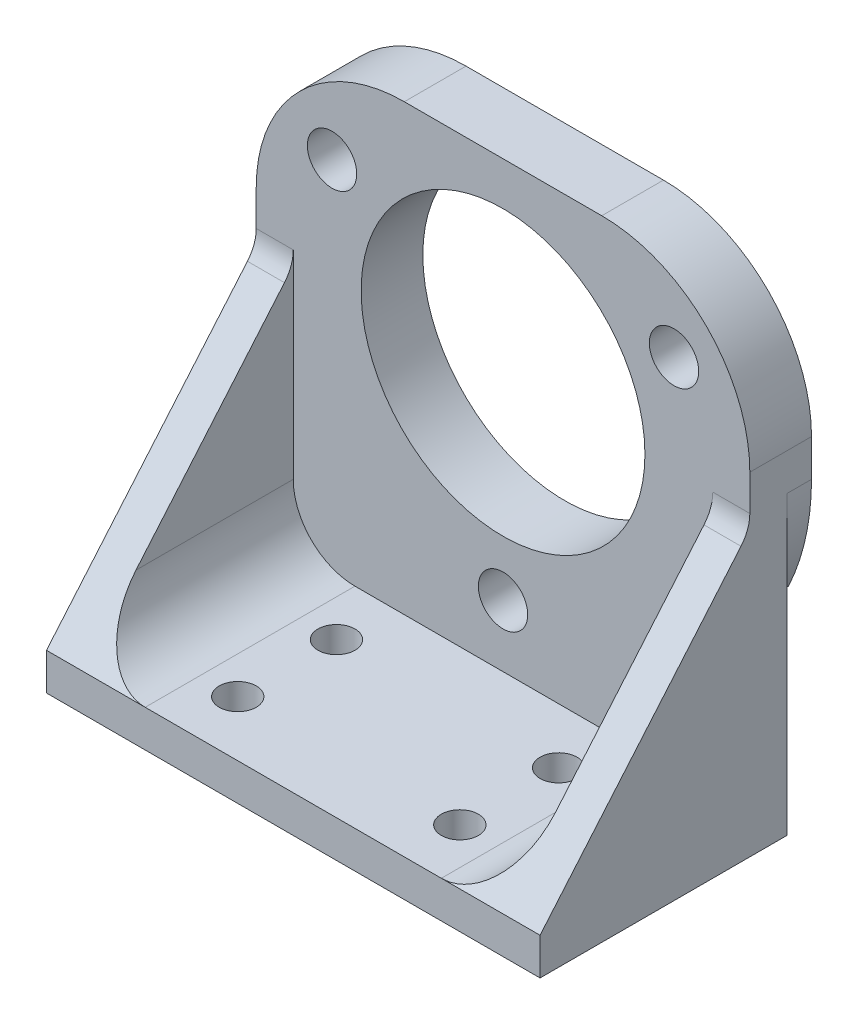
ISO-10303-21;
HEADER;
FILE_DESCRIPTION(('STEP AP214'),'2;1');
FILE_NAME('part.step','',(''),(''),'','','');
FILE_SCHEMA(('AUTOMOTIVE_DESIGN { 1 0 10303 214 1 1 1 1 }'));
ENDSEC;
DATA;
#1=APPLICATION_CONTEXT('core data for automotive mechanical design processes');
#2=APPLICATION_PROTOCOL_DEFINITION('international standard','automotive_design',2000,#1);
#3=PRODUCT_CONTEXT('',#1,'mechanical');
#4=PRODUCT('Part','Part','',(#3));
#5=PRODUCT_RELATED_PRODUCT_CATEGORY('part','',(#4));
#6=PRODUCT_DEFINITION_FORMATION('','',#4);
#7=PRODUCT_DEFINITION_CONTEXT('part definition',#1,'design');
#8=PRODUCT_DEFINITION('design','',#6,#7);
#9=PRODUCT_DEFINITION_SHAPE('','',#8);
#10=(LENGTH_UNIT() NAMED_UNIT(*) SI_UNIT(.MILLI.,.METRE.));
#11=(NAMED_UNIT(*) PLANE_ANGLE_UNIT() SI_UNIT($,.RADIAN.));
#12=(NAMED_UNIT(*) SI_UNIT($,.STERADIAN.) SOLID_ANGLE_UNIT());
#13=UNCERTAINTY_MEASURE_WITH_UNIT(LENGTH_MEASURE(1.E-05),#10,'distance_accuracy_value','');
#14=(GEOMETRIC_REPRESENTATION_CONTEXT(3) GLOBAL_UNCERTAINTY_ASSIGNED_CONTEXT((#13)) GLOBAL_UNIT_ASSIGNED_CONTEXT((#10,
#11,#12)) REPRESENTATION_CONTEXT('',''));
#15=CARTESIAN_POINT('',(0.,0.,0.));
#16=DIRECTION('',(0.,0.,1.));
#17=DIRECTION('',(1.,0.,0.));
#18=AXIS2_PLACEMENT_3D('',#15,#16,#17);
#19=CARTESIAN_POINT('',(0.,3.,0.));
#20=DIRECTION('',(0.,-1.,0.));
#21=DIRECTION('',(0.,0.,-1.));
#22=AXIS2_PLACEMENT_3D('',#19,#20,#21);
#23=PLANE('',#22);
#24=CARTESIAN_POINT('',(9.,3.,5.5));
#25=DIRECTION('',(0.,1.,0.));
#26=DIRECTION('',(0.,0.,1.));
#27=AXIS2_PLACEMENT_3D('',#24,#25,#26);
#28=CIRCLE('',#27,1.5);
#29=CARTESIAN_POINT('',(9.,3.,7.));
#30=VERTEX_POINT('',#29);
#31=EDGE_CURVE('E791',#30,#30,#28,.T.);
#32=ORIENTED_EDGE('',*,*,#31,.F.);
#33=EDGE_LOOP('',(#32));
#34=FACE_BOUND('',#33,.T.);
#35=CARTESIAN_POINT('',(-9.,3.,-2.5));
#36=DIRECTION('',(0.,1.,0.));
#37=DIRECTION('',(0.,0.,1.));
#38=AXIS2_PLACEMENT_3D('',#35,#36,#37);
#39=CIRCLE('',#38,1.5);
#40=CARTESIAN_POINT('',(-9.,3.,-1.));
#41=VERTEX_POINT('',#40);
#42=EDGE_CURVE('E784',#41,#41,#39,.T.);
#43=ORIENTED_EDGE('',*,*,#42,.F.);
#44=EDGE_LOOP('',(#43));
#45=FACE_BOUND('',#44,.T.);
#46=CARTESIAN_POINT('',(-9.,3.,5.5));
#47=DIRECTION('',(0.,1.,0.));
#48=DIRECTION('',(0.,0.,-1.));
#49=AXIS2_PLACEMENT_3D('',#46,#47,#48);
#50=CIRCLE('',#49,1.5);
#51=CARTESIAN_POINT('',(-9.,3.,4.));
#52=VERTEX_POINT('',#51);
#53=EDGE_CURVE('E796',#52,#52,#50,.T.);
#54=ORIENTED_EDGE('',*,*,#53,.F.);
#55=EDGE_LOOP('',(#54));
#56=FACE_BOUND('',#55,.T.);
#57=CARTESIAN_POINT('',(9.,3.,-2.5));
#58=DIRECTION('',(0.,1.,0.));
#59=DIRECTION('',(0.,0.,-1.));
#60=AXIS2_PLACEMENT_3D('',#57,#58,#59);
#61=CIRCLE('',#60,1.5);
#62=CARTESIAN_POINT('',(9.,3.,-4.));
#63=VERTEX_POINT('',#62);
#64=EDGE_CURVE('E778',#63,#63,#61,.T.);
#65=ORIENTED_EDGE('',*,*,#64,.F.);
#66=EDGE_LOOP('',(#65));
#67=FACE_BOUND('',#66,.T.);
#68=DIRECTION('',(1.,0.,0.));
#69=VECTOR('',#68,1.);
#70=CARTESIAN_POINT('',(-20.,3.,10.));
#71=LINE('',#70,#69);
#72=CARTESIAN_POINT('',(-12.,3.,10.));
#73=VERTEX_POINT('',#72);
#74=CARTESIAN_POINT('',(12.,3.,10.));
#75=VERTEX_POINT('',#74);
#76=EDGE_CURVE('E211',#73,#75,#71,.T.);
#77=ORIENTED_EDGE('',*,*,#76,.T.);
#78=DIRECTION('',(0.,0.,1.));
#79=VECTOR('',#78,1.);
#80=CARTESIAN_POINT('',(12.,3.,-7.));
#81=LINE('',#80,#79);
#82=CARTESIAN_POINT('',(12.,3.,-7.));
#83=VERTEX_POINT('',#82);
#84=EDGE_CURVE('E253',#75,#83,#81,.F.);
#85=ORIENTED_EDGE('',*,*,#84,.T.);
#86=DIRECTION('',(1.,0.,0.));
#87=VECTOR('',#86,1.);
#88=CARTESIAN_POINT('',(-20.,3.,-7.));
#89=LINE('',#88,#87);
#90=CARTESIAN_POINT('',(-12.,3.,-7.));
#91=VERTEX_POINT('',#90);
#92=EDGE_CURVE('E371',#91,#83,#89,.T.);
#93=ORIENTED_EDGE('',*,*,#92,.F.);
#94=DIRECTION('',(0.,0.,-1.));
#95=VECTOR('',#94,1.);
#96=CARTESIAN_POINT('',(-12.,3.,10.));
#97=LINE('',#96,#95);
#98=EDGE_CURVE('E250',#91,#73,#97,.F.);
#99=ORIENTED_EDGE('',*,*,#98,.T.);
#100=EDGE_LOOP('',(#77,#85,#93,#99));
#101=FACE_BOUND('',#100,.T.);
#102=ADVANCED_FACE('F39',(#34,#45,#56,#67,#101),#23,.F.);
#103=CARTESIAN_POINT('',(-20.,39.,-7.));
#104=DIRECTION('',(0.,0.,-1.));
#105=DIRECTION('',(-1.,0.,0.));
#106=AXIS2_PLACEMENT_3D('',#103,#104,#105);
#107=PLANE('',#106);
#108=CARTESIAN_POINT('',(0.,24.,-7.));
#109=DIRECTION('',(0.,0.,1.));
#110=DIRECTION('',(1.,0.,0.));
#111=AXIS2_PLACEMENT_3D('',#108,#109,#110);
#112=CIRCLE('',#111,11.5);
#113=CARTESIAN_POINT('',(11.5,24.,-7.));
#114=VERTEX_POINT('',#113);
#115=EDGE_CURVE('E363',#114,#114,#112,.T.);
#116=ORIENTED_EDGE('',*,*,#115,.F.);
#117=EDGE_LOOP('',(#116));
#118=FACE_BOUND('',#117,.T.);
#119=CARTESIAN_POINT('',(0.,8.,-7.));
#120=DIRECTION('',(0.,0.,1.));
#121=DIRECTION('',(1.,0.,0.));
#122=AXIS2_PLACEMENT_3D('',#119,#120,#121);
#123=CIRCLE('',#122,2.);
#124=CARTESIAN_POINT('',(1.99999999999996,8.,-7.));
#125=VERTEX_POINT('',#124);
#126=EDGE_CURVE('E364',#125,#125,#123,.T.);
#127=ORIENTED_EDGE('',*,*,#126,.F.);
#128=EDGE_LOOP('',(#127));
#129=FACE_BOUND('',#128,.T.);
#130=DIRECTION('',(0.,-1.,0.));
#131=VECTOR('',#130,1.);
#132=CARTESIAN_POINT('',(17.,23.,-7.));
#133=LINE('',#132,#131);
#134=CARTESIAN_POINT('',(17.,24.1027310876729,-7.));
#135=VERTEX_POINT('',#134);
#136=CARTESIAN_POINT('',(17.,8.,-7.));
#137=VERTEX_POINT('',#136);
#138=EDGE_CURVE('E300',#135,#137,#133,.T.);
#139=ORIENTED_EDGE('',*,*,#138,.F.);
#140=DIRECTION('',(-1.,0.,0.));
#141=VECTOR('',#140,1.);
#142=CARTESIAN_POINT('',(20.,24.1027310876729,-7.));
#143=LINE('',#142,#141);
#144=CARTESIAN_POINT('',(20.,24.1027310876729,-7.));
#145=VERTEX_POINT('',#144);
#146=EDGE_CURVE('E271',#135,#145,#143,.F.);
#147=ORIENTED_EDGE('',*,*,#146,.T.);
#148=DIRECTION('',(0.,-1.,0.));
#149=VECTOR('',#148,1.);
#150=CARTESIAN_POINT('',(20.,39.,-7.));
#151=LINE('',#150,#149);
#152=CARTESIAN_POINT('',(20.,27.,-7.));
#153=VERTEX_POINT('',#152);
#154=EDGE_CURVE('E292',#153,#145,#151,.T.);
#155=ORIENTED_EDGE('',*,*,#154,.F.);
#156=CARTESIAN_POINT('',(8.,27.,-7.));
#157=DIRECTION('',(0.,0.,-1.));
#158=DIRECTION('',(-1.,0.,0.));
#159=AXIS2_PLACEMENT_3D('',#156,#157,#158);
#160=CIRCLE('',#159,12.);
#161=CARTESIAN_POINT('',(8.,39.,-7.));
#162=VERTEX_POINT('',#161);
#163=EDGE_CURVE('E227',#153,#162,#160,.F.);
#164=ORIENTED_EDGE('',*,*,#163,.T.);
#165=DIRECTION('',(1.,0.,0.));
#166=VECTOR('',#165,1.);
#167=CARTESIAN_POINT('',(-20.,39.,-7.));
#168=LINE('',#167,#166);
#169=CARTESIAN_POINT('',(-8.,39.,-7.));
#170=VERTEX_POINT('',#169);
#171=EDGE_CURVE('E372',#170,#162,#168,.T.);
#172=ORIENTED_EDGE('',*,*,#171,.F.);
#173=CARTESIAN_POINT('',(-8.,27.,-7.));
#174=DIRECTION('',(0.,0.,-1.));
#175=DIRECTION('',(-1.,0.,0.));
#176=AXIS2_PLACEMENT_3D('',#173,#174,#175);
#177=CIRCLE('',#176,12.);
#178=CARTESIAN_POINT('',(-20.,27.,-7.));
#179=VERTEX_POINT('',#178);
#180=EDGE_CURVE('E229',#170,#179,#177,.F.);
#181=ORIENTED_EDGE('',*,*,#180,.T.);
#182=DIRECTION('',(0.,-1.,0.));
#183=VECTOR('',#182,1.);
#184=CARTESIAN_POINT('',(-20.,39.,-7.));
#185=LINE('',#184,#183);
#186=CARTESIAN_POINT('',(-20.,24.1027310876729,-7.));
#187=VERTEX_POINT('',#186);
#188=EDGE_CURVE('E284',#179,#187,#185,.T.);
#189=ORIENTED_EDGE('',*,*,#188,.T.);
#190=DIRECTION('',(-1.,0.,0.));
#191=VECTOR('',#190,1.);
#192=CARTESIAN_POINT('',(-17.,24.1027310876729,-7.));
#193=LINE('',#192,#191);
#194=CARTESIAN_POINT('',(-17.,24.1027310876729,-7.));
#195=VERTEX_POINT('',#194);
#196=EDGE_CURVE('E268',#187,#195,#193,.F.);
#197=ORIENTED_EDGE('',*,*,#196,.T.);
#198=DIRECTION('',(0.,-1.,0.));
#199=VECTOR('',#198,1.);
#200=CARTESIAN_POINT('',(-17.,23.,-7.));
#201=LINE('',#200,#199);
#202=CARTESIAN_POINT('',(-17.,8.,-7.));
#203=VERTEX_POINT('',#202);
#204=EDGE_CURVE('E303',#195,#203,#201,.T.);
#205=ORIENTED_EDGE('',*,*,#204,.T.);
#206=CARTESIAN_POINT('',(-12.,8.,-7.));
#207=DIRECTION('',(0.,0.,-1.));
#208=DIRECTION('',(-1.,0.,0.));
#209=AXIS2_PLACEMENT_3D('',#206,#207,#208);
#210=CIRCLE('',#209,5.);
#211=EDGE_CURVE('E255',#203,#91,#210,.F.);
#212=ORIENTED_EDGE('',*,*,#211,.T.);
#213=ORIENTED_EDGE('',*,*,#92,.T.);
#214=CARTESIAN_POINT('',(12.,8.,-7.));
#215=DIRECTION('',(0.,0.,-1.));
#216=DIRECTION('',(-1.,0.,0.));
#217=AXIS2_PLACEMENT_3D('',#214,#215,#216);
#218=CIRCLE('',#217,5.);
#219=EDGE_CURVE('E257',#83,#137,#218,.F.);
#220=ORIENTED_EDGE('',*,*,#219,.T.);
#221=EDGE_LOOP('',(#139,#147,#155,#164,#172,#181,#189,#197,#205,#212,#213,#220));
#222=FACE_BOUND('',#221,.T.);
#223=CARTESIAN_POINT('',(13.856406460551,32.,-7.));
#224=DIRECTION('',(0.,0.,1.));
#225=DIRECTION('',(1.,0.,0.));
#226=AXIS2_PLACEMENT_3D('',#223,#224,#225);
#227=CIRCLE('',#226,2.00000000000001);
#228=CARTESIAN_POINT('',(15.856406460551,32.,-7.));
#229=VERTEX_POINT('',#228);
#230=EDGE_CURVE('E360',#229,#229,#227,.T.);
#231=ORIENTED_EDGE('',*,*,#230,.F.);
#232=EDGE_LOOP('',(#231));
#233=FACE_BOUND('',#232,.T.);
#234=CARTESIAN_POINT('',(-13.856406460551,32.,-7.));
#235=DIRECTION('',(0.,0.,1.));
#236=DIRECTION('',(1.,0.,0.));
#237=AXIS2_PLACEMENT_3D('',#234,#235,#236);
#238=CIRCLE('',#237,2.);
#239=CARTESIAN_POINT('',(-11.856406460551,32.,-7.));
#240=VERTEX_POINT('',#239);
#241=EDGE_CURVE('E359',#240,#240,#238,.T.);
#242=ORIENTED_EDGE('',*,*,#241,.F.);
#243=EDGE_LOOP('',(#242));
#244=FACE_BOUND('',#243,.T.);
#245=ADVANCED_FACE('F287',(#118,#129,#222,#233,#244),#107,.F.);
#246=CARTESIAN_POINT('',(0.,24.,-12.));
#247=DIRECTION('',(0.,0.,1.));
#248=DIRECTION('',(1.,0.,0.));
#249=AXIS2_PLACEMENT_3D('',#246,#247,#248);
#250=CYLINDRICAL_SURFACE('',#249,20.);
#251=CARTESIAN_POINT('',(0.,24.,-10.));
#252=DIRECTION('',(0.,0.,-1.));
#253=DIRECTION('',(-1.,0.,0.));
#254=AXIS2_PLACEMENT_3D('',#251,#252,#253);
#255=CIRCLE('',#254,20.);
#256=CARTESIAN_POINT('',(20.,24.,-10.));
#257=VERTEX_POINT('',#256);
#258=CARTESIAN_POINT('',(18.1379974784315,15.5730760373423,-10.));
#259=VERTEX_POINT('',#258);
#260=EDGE_CURVE('E350',#257,#259,#255,.T.);
#261=ORIENTED_EDGE('',*,*,#260,.T.);
#262=DIRECTION('',(0.,0.,-1.));
#263=VECTOR('',#262,1.);
#264=CARTESIAN_POINT('',(18.1379974784315,15.5730760373424,-11.));
#265=LINE('',#264,#263);
#266=CARTESIAN_POINT('',(18.1379974784315,15.5730760373423,-12.));
#267=VERTEX_POINT('',#266);
#268=EDGE_CURVE('E244',#259,#267,#265,.T.);
#269=ORIENTED_EDGE('',*,*,#268,.T.);
#270=CARTESIAN_POINT('',(0.,24.,-12.));
#271=DIRECTION('',(0.,0.,-1.));
#272=DIRECTION('',(-1.,0.,0.));
#273=AXIS2_PLACEMENT_3D('',#270,#271,#272);
#274=CIRCLE('',#273,20.);
#275=CARTESIAN_POINT('',(20.,24.,-12.));
#276=VERTEX_POINT('',#275);
#277=EDGE_CURVE('E330',#276,#267,#274,.T.);
#278=ORIENTED_EDGE('',*,*,#277,.F.);
#279=DIRECTION('',(0.,0.,1.));
#280=VECTOR('',#279,1.);
#281=CARTESIAN_POINT('',(20.,24.,-12.));
#282=LINE('',#281,#280);
#283=EDGE_CURVE('E349',#276,#257,#282,.T.);
#284=ORIENTED_EDGE('',*,*,#283,.T.);
#285=EDGE_LOOP('',(#261,#269,#278,#284));
#286=FACE_BOUND('',#285,.T.);
#287=ADVANCED_FACE('F394',(#286),#250,.T.);
#288=CARTESIAN_POINT('',(16.3669289666371,12.5054953912292,-12.));
#289=VERTEX_POINT('',#288);
#290=CARTESIAN_POINT('',(-16.3669289666371,12.5054953912292,-12.));
#291=VERTEX_POINT('',#290);
#292=EDGE_CURVE('E334',#289,#291,#274,.T.);
#293=ORIENTED_EDGE('',*,*,#292,.F.);
#294=DIRECTION('',(0.,0.,-1.));
#295=VECTOR('',#294,1.);
#296=CARTESIAN_POINT('',(16.3669289666371,12.5054953912291,-11.));
#297=LINE('',#296,#295);
#298=CARTESIAN_POINT('',(16.3669289666371,12.5054953912292,-10.));
#299=VERTEX_POINT('',#298);
#300=EDGE_CURVE('E241',#289,#299,#297,.F.);
#301=ORIENTED_EDGE('',*,*,#300,.T.);
#302=CARTESIAN_POINT('',(-16.3669289666371,12.5054953912292,-10.));
#303=VERTEX_POINT('',#302);
#304=EDGE_CURVE('E353',#299,#303,#255,.T.);
#305=ORIENTED_EDGE('',*,*,#304,.T.);
#306=DIRECTION('',(0.,0.,-1.));
#307=VECTOR('',#306,1.);
#308=CARTESIAN_POINT('',(-16.3669289666371,12.5054953912291,-11.));
#309=LINE('',#308,#307);
#310=EDGE_CURVE('E238',#303,#291,#309,.T.);
#311=ORIENTED_EDGE('',*,*,#310,.T.);
#312=EDGE_LOOP('',(#293,#301,#305,#311));
#313=FACE_BOUND('',#312,.T.);
#314=ADVANCED_FACE('F431',(#313),#250,.T.);
#315=CARTESIAN_POINT('',(20.,3.,10.));
#316=DIRECTION('',(-1.,0.,0.));
#317=DIRECTION('',(0.,0.,1.));
#318=AXIS2_PLACEMENT_3D('',#315,#316,#317);
#319=PLANE('',#318);
#320=ORIENTED_EDGE('',*,*,#154,.T.);
#321=CARTESIAN_POINT('',(20.,24.1027310876729,-4.));
#322=DIRECTION('',(-1.,0.,0.));
#323=DIRECTION('',(0.,0.,1.));
#324=AXIS2_PLACEMENT_3D('',#321,#322,#323);
#325=CIRCLE('',#324,3.);
#326=CARTESIAN_POINT('',(20.,22.1597858273863,-6.28581795327838));
#327=VERTEX_POINT('',#326);
#328=EDGE_CURVE('E188',#145,#327,#325,.T.);
#329=ORIENTED_EDGE('',*,*,#328,.T.);
#330=DIRECTION('',(0.,-0.761939317759459,0.64764842009554));
#331=VECTOR('',#330,1.);
#332=CARTESIAN_POINT('',(20.,23.,-7.));
#333=LINE('',#332,#331);
#334=CARTESIAN_POINT('',(20.,3.,10.));
#335=VERTEX_POINT('',#334);
#336=EDGE_CURVE('E179',#327,#335,#333,.T.);
#337=ORIENTED_EDGE('',*,*,#336,.T.);
#338=DIRECTION('',(0.,-1.,0.));
#339=VECTOR('',#338,1.);
#340=CARTESIAN_POINT('',(20.,3.,10.));
#341=LINE('',#340,#339);
#342=CARTESIAN_POINT('',(20.,0.,10.));
#343=VERTEX_POINT('',#342);
#344=EDGE_CURVE('E185',#335,#343,#341,.T.);
#345=ORIENTED_EDGE('',*,*,#344,.T.);
#346=DIRECTION('',(0.,0.,-1.));
#347=VECTOR('',#346,1.);
#348=CARTESIAN_POINT('',(20.,0.,10.));
#349=LINE('',#348,#347);
#350=CARTESIAN_POINT('',(20.,0.,-10.));
#351=VERTEX_POINT('',#350);
#352=EDGE_CURVE('E291',#343,#351,#349,.T.);
#353=ORIENTED_EDGE('',*,*,#352,.T.);
#354=DIRECTION('',(0.,-1.,0.));
#355=VECTOR('',#354,1.);
#356=CARTESIAN_POINT('',(20.,3.,-10.));
#357=LINE('',#356,#355);
#358=EDGE_CURVE('E220',#257,#351,#357,.T.);
#359=ORIENTED_EDGE('',*,*,#358,.F.);
#360=ORIENTED_EDGE('',*,*,#283,.F.);
#361=DIRECTION('',(0.,-1.,0.));
#362=VECTOR('',#361,1.);
#363=CARTESIAN_POINT('',(20.,27.,-12.));
#364=LINE('',#363,#362);
#365=CARTESIAN_POINT('',(20.,27.,-12.));
#366=VERTEX_POINT('',#365);
#367=EDGE_CURVE('E347',#366,#276,#364,.T.);
#368=ORIENTED_EDGE('',*,*,#367,.F.);
#369=DIRECTION('',(0.,0.,-1.));
#370=VECTOR('',#369,1.);
#371=CARTESIAN_POINT('',(20.,27.,-7.));
#372=LINE('',#371,#370);
#373=EDGE_CURVE('E233',#366,#153,#372,.F.);
#374=ORIENTED_EDGE('',*,*,#373,.T.);
#375=EDGE_LOOP('',(#320,#329,#337,#345,#353,#359,#360,#368,#374));
#376=FACE_BOUND('',#375,.T.);
#377=ADVANCED_FACE('F182',(#376),#319,.F.);
#378=CARTESIAN_POINT('',(-20.,3.,-10.));
#379=DIRECTION('',(0.,0.,1.));
#380=DIRECTION('',(1.,0.,0.));
#381=AXIS2_PLACEMENT_3D('',#378,#379,#380);
#382=PLANE('',#381);
#383=ORIENTED_EDGE('',*,*,#304,.F.);
#384=CARTESIAN_POINT('',(15.1554445662277,15.25,-10.));
#385=DIRECTION('',(0.,0.,-1.));
#386=DIRECTION('',(-1.,0.,0.));
#387=AXIS2_PLACEMENT_3D('',#384,#385,#386);
#388=CIRCLE('',#387,3.);
#389=EDGE_CURVE('E310',#299,#259,#388,.T.);
#390=ORIENTED_EDGE('',*,*,#389,.T.);
#391=ORIENTED_EDGE('',*,*,#260,.F.);
#392=ORIENTED_EDGE('',*,*,#358,.T.);
#393=DIRECTION('',(-1.,0.,0.));
#394=VECTOR('',#393,1.);
#395=CARTESIAN_POINT('',(-20.,0.,-10.));
#396=LINE('',#395,#394);
#397=CARTESIAN_POINT('',(-20.,0.,-10.));
#398=VERTEX_POINT('',#397);
#399=EDGE_CURVE('E379',#351,#398,#396,.T.);
#400=ORIENTED_EDGE('',*,*,#399,.T.);
#401=DIRECTION('',(0.,-1.,0.));
#402=VECTOR('',#401,1.);
#403=CARTESIAN_POINT('',(-20.,3.,-10.));
#404=LINE('',#403,#402);
#405=CARTESIAN_POINT('',(-20.,24.,-10.));
#406=VERTEX_POINT('',#405);
#407=EDGE_CURVE('E213',#406,#398,#404,.T.);
#408=ORIENTED_EDGE('',*,*,#407,.F.);
#409=CARTESIAN_POINT('',(-18.1379974784315,15.5730760373424,-10.));
#410=VERTEX_POINT('',#409);
#411=EDGE_CURVE('E329',#410,#406,#255,.T.);
#412=ORIENTED_EDGE('',*,*,#411,.F.);
#413=CARTESIAN_POINT('',(-15.1554445662277,15.25,-10.));
#414=DIRECTION('',(0.,0.,-1.));
#415=DIRECTION('',(1.,0.,0.));
#416=AXIS2_PLACEMENT_3D('',#413,#414,#415);
#417=CIRCLE('',#416,3.);
#418=EDGE_CURVE('E315',#410,#303,#417,.T.);
#419=ORIENTED_EDGE('',*,*,#418,.T.);
#420=EDGE_LOOP('',(#383,#390,#391,#392,#400,#408,#412,#419));
#421=FACE_BOUND('',#420,.T.);
#422=ADVANCED_FACE('F422',(#421),#382,.F.);
#423=CARTESIAN_POINT('',(-20.,3.,10.));
#424=DIRECTION('',(1.,0.,0.));
#425=DIRECTION('',(0.,0.,-1.));
#426=AXIS2_PLACEMENT_3D('',#423,#424,#425);
#427=PLANE('',#426);
#428=DIRECTION('',(0.,-1.,0.));
#429=VECTOR('',#428,1.);
#430=CARTESIAN_POINT('',(-20.,3.,10.));
#431=LINE('',#430,#429);
#432=CARTESIAN_POINT('',(-20.,3.,10.));
#433=VERTEX_POINT('',#432);
#434=CARTESIAN_POINT('',(-20.,0.,10.));
#435=VERTEX_POINT('',#434);
#436=EDGE_CURVE('E210',#433,#435,#431,.T.);
#437=ORIENTED_EDGE('',*,*,#436,.F.);
#438=DIRECTION('',(0.,-0.761939317759459,0.64764842009554));
#439=VECTOR('',#438,1.);
#440=CARTESIAN_POINT('',(-20.,23.,-7.));
#441=LINE('',#440,#439);
#442=CARTESIAN_POINT('',(-20.,22.1597858273863,-6.28581795327838));
#443=VERTEX_POINT('',#442);
#444=EDGE_CURVE('E193',#443,#433,#441,.T.);
#445=ORIENTED_EDGE('',*,*,#444,.F.);
#446=CARTESIAN_POINT('',(-20.,24.1027310876729,-4.));
#447=DIRECTION('',(1.,0.,0.));
#448=DIRECTION('',(0.,0.,-1.));
#449=AXIS2_PLACEMENT_3D('',#446,#447,#448);
#450=CIRCLE('',#449,3.);
#451=EDGE_CURVE('E47',#443,#187,#450,.T.);
#452=ORIENTED_EDGE('',*,*,#451,.T.);
#453=ORIENTED_EDGE('',*,*,#188,.F.);
#454=DIRECTION('',(0.,0.,1.));
#455=VECTOR('',#454,1.);
#456=CARTESIAN_POINT('',(-20.,27.,-10.));
#457=LINE('',#456,#455);
#458=CARTESIAN_POINT('',(-20.,27.,-12.));
#459=VERTEX_POINT('',#458);
#460=EDGE_CURVE('E231',#179,#459,#457,.F.);
#461=ORIENTED_EDGE('',*,*,#460,.T.);
#462=DIRECTION('',(0.,1.,0.));
#463=VECTOR('',#462,1.);
#464=CARTESIAN_POINT('',(-20.,27.,-12.));
#465=LINE('',#464,#463);
#466=CARTESIAN_POINT('',(-20.,24.,-12.));
#467=VERTEX_POINT('',#466);
#468=EDGE_CURVE('E333',#467,#459,#465,.T.);
#469=ORIENTED_EDGE('',*,*,#468,.F.);
#470=DIRECTION('',(0.,0.,1.));
#471=VECTOR('',#470,1.);
#472=CARTESIAN_POINT('',(-20.,24.,-12.));
#473=LINE('',#472,#471);
#474=EDGE_CURVE('E356',#467,#406,#473,.T.);
#475=ORIENTED_EDGE('',*,*,#474,.T.);
#476=ORIENTED_EDGE('',*,*,#407,.T.);
#477=DIRECTION('',(0.,0.,1.));
#478=VECTOR('',#477,1.);
#479=CARTESIAN_POINT('',(-20.,0.,10.));
#480=LINE('',#479,#478);
#481=EDGE_CURVE('E381',#398,#435,#480,.T.);
#482=ORIENTED_EDGE('',*,*,#481,.T.);
#483=EDGE_LOOP('',(#437,#445,#452,#453,#461,#469,#475,#476,#482));
#484=FACE_BOUND('',#483,.T.);
#485=ADVANCED_FACE('F283',(#484),#427,.F.);
#486=CARTESIAN_POINT('',(-20.,3.,10.));
#487=DIRECTION('',(0.,0.,-1.));
#488=DIRECTION('',(-1.,0.,0.));
#489=AXIS2_PLACEMENT_3D('',#486,#487,#488);
#490=PLANE('',#489);
#491=ORIENTED_EDGE('',*,*,#344,.F.);
#492=DIRECTION('',(-1.,0.,0.));
#493=VECTOR('',#492,1.);
#494=CARTESIAN_POINT('',(20.,3.,10.));
#495=LINE('',#494,#493);
#496=EDGE_CURVE('E196',#335,#75,#495,.T.);
#497=ORIENTED_EDGE('',*,*,#496,.T.);
#498=ORIENTED_EDGE('',*,*,#76,.F.);
#499=EDGE_CURVE('E192',#73,#433,#495,.T.);
#500=ORIENTED_EDGE('',*,*,#499,.T.);
#501=ORIENTED_EDGE('',*,*,#436,.T.);
#502=DIRECTION('',(1.,0.,0.));
#503=VECTOR('',#502,1.);
#504=CARTESIAN_POINT('',(-20.,0.,10.));
#505=LINE('',#504,#503);
#506=EDGE_CURVE('E208',#435,#343,#505,.T.);
#507=ORIENTED_EDGE('',*,*,#506,.T.);
#508=EDGE_LOOP('',(#491,#497,#498,#500,#501,#507));
#509=FACE_BOUND('',#508,.T.);
#510=ADVANCED_FACE('F206',(#509),#490,.F.);
#511=CARTESIAN_POINT('',(0.,0.,0.));
#512=DIRECTION('',(0.,-1.,0.));
#513=DIRECTION('',(0.,0.,-1.));
#514=AXIS2_PLACEMENT_3D('',#511,#512,#513);
#515=PLANE('',#514);
#516=CARTESIAN_POINT('',(9.,0.,5.5));
#517=DIRECTION('',(0.,1.,0.));
#518=DIRECTION('',(0.,0.,1.));
#519=AXIS2_PLACEMENT_3D('',#516,#517,#518);
#520=CIRCLE('',#519,1.5);
#521=CARTESIAN_POINT('',(9.,0.,7.));
#522=VERTEX_POINT('',#521);
#523=EDGE_CURVE('E781',#522,#522,#520,.T.);
#524=ORIENTED_EDGE('',*,*,#523,.T.);
#525=EDGE_LOOP('',(#524));
#526=FACE_BOUND('',#525,.T.);
#527=CARTESIAN_POINT('',(-9.,0.,-2.5));
#528=DIRECTION('',(0.,1.,0.));
#529=DIRECTION('',(0.,0.,1.));
#530=AXIS2_PLACEMENT_3D('',#527,#528,#529);
#531=CIRCLE('',#530,1.5);
#532=CARTESIAN_POINT('',(-9.,0.,-1.));
#533=VERTEX_POINT('',#532);
#534=EDGE_CURVE('E787',#533,#533,#531,.T.);
#535=ORIENTED_EDGE('',*,*,#534,.T.);
#536=EDGE_LOOP('',(#535));
#537=FACE_BOUND('',#536,.T.);
#538=CARTESIAN_POINT('',(-9.,0.,5.5));
#539=DIRECTION('',(0.,1.,0.));
#540=DIRECTION('',(0.,0.,-1.));
#541=AXIS2_PLACEMENT_3D('',#538,#539,#540);
#542=CIRCLE('',#541,1.5);
#543=CARTESIAN_POINT('',(-9.,0.,4.));
#544=VERTEX_POINT('',#543);
#545=EDGE_CURVE('E788',#544,#544,#542,.T.);
#546=ORIENTED_EDGE('',*,*,#545,.T.);
#547=EDGE_LOOP('',(#546));
#548=FACE_BOUND('',#547,.T.);
#549=CARTESIAN_POINT('',(9.,0.,-2.5));
#550=DIRECTION('',(0.,1.,0.));
#551=DIRECTION('',(0.,0.,-1.));
#552=AXIS2_PLACEMENT_3D('',#549,#550,#551);
#553=CIRCLE('',#552,1.5);
#554=CARTESIAN_POINT('',(9.,0.,-4.));
#555=VERTEX_POINT('',#554);
#556=EDGE_CURVE('E776',#555,#555,#553,.T.);
#557=ORIENTED_EDGE('',*,*,#556,.T.);
#558=EDGE_LOOP('',(#557));
#559=FACE_BOUND('',#558,.T.);
#560=ORIENTED_EDGE('',*,*,#352,.F.);
#561=ORIENTED_EDGE('',*,*,#506,.F.);
#562=ORIENTED_EDGE('',*,*,#481,.F.);
#563=ORIENTED_EDGE('',*,*,#399,.F.);
#564=EDGE_LOOP('',(#560,#561,#562,#563));
#565=FACE_BOUND('',#564,.T.);
#566=ADVANCED_FACE('F387',(#526,#537,#548,#559,#565),#515,.T.);
#567=CARTESIAN_POINT('',(0.,39.,0.));
#568=DIRECTION('',(0.,1.,0.));
#569=DIRECTION('',(0.,0.,1.));
#570=AXIS2_PLACEMENT_3D('',#567,#568,#569);
#571=PLANE('',#570);
#572=DIRECTION('',(0.,0.,-1.));
#573=VECTOR('',#572,1.);
#574=CARTESIAN_POINT('',(8.,39.,-10.));
#575=LINE('',#574,#573);
#576=CARTESIAN_POINT('',(8.,39.,-12.));
#577=VERTEX_POINT('',#576);
#578=EDGE_CURVE('E222',#162,#577,#575,.T.);
#579=ORIENTED_EDGE('',*,*,#578,.T.);
#580=DIRECTION('',(1.,0.,0.));
#581=VECTOR('',#580,1.);
#582=CARTESIAN_POINT('',(8.,39.,-12.));
#583=LINE('',#582,#581);
#584=CARTESIAN_POINT('',(-8.,39.,-12.));
#585=VERTEX_POINT('',#584);
#586=EDGE_CURVE('E341',#585,#577,#583,.T.);
#587=ORIENTED_EDGE('',*,*,#586,.F.);
#588=DIRECTION('',(0.,0.,1.));
#589=VECTOR('',#588,1.);
#590=CARTESIAN_POINT('',(-8.,39.,-7.));
#591=LINE('',#590,#589);
#592=EDGE_CURVE('E224',#585,#170,#591,.T.);
#593=ORIENTED_EDGE('',*,*,#592,.T.);
#594=ORIENTED_EDGE('',*,*,#171,.T.);
#595=EDGE_LOOP('',(#579,#587,#593,#594));
#596=FACE_BOUND('',#595,.T.);
#597=ADVANCED_FACE('F411',(#596),#571,.T.);
#598=CARTESIAN_POINT('',(0.,24.,-10.));
#599=DIRECTION('',(0.,0.,1.));
#600=DIRECTION('',(1.,0.,0.));
#601=AXIS2_PLACEMENT_3D('',#598,#599,#600);
#602=CYLINDRICAL_SURFACE('',#601,11.5);
#603=ORIENTED_EDGE('',*,*,#115,.T.);
#604=EDGE_LOOP('',(#603));
#605=FACE_BOUND('',#604,.T.);
#606=CARTESIAN_POINT('',(0.,24.,-12.));
#607=DIRECTION('',(0.,0.,-1.));
#608=DIRECTION('',(-1.,0.,0.));
#609=AXIS2_PLACEMENT_3D('',#606,#607,#608);
#610=CIRCLE('',#609,11.5);
#611=CARTESIAN_POINT('',(-11.5,24.,-12.));
#612=VERTEX_POINT('',#611);
#613=EDGE_CURVE('E312',#612,#612,#610,.T.);
#614=ORIENTED_EDGE('',*,*,#613,.T.);
#615=EDGE_LOOP('',(#614));
#616=FACE_BOUND('',#615,.T.);
#617=ADVANCED_FACE('F466',(#605,#616),#602,.F.);
#618=CARTESIAN_POINT('',(13.856406460551,32.,-10.));
#619=DIRECTION('',(0.,0.,1.));
#620=DIRECTION('',(1.,0.,0.));
#621=AXIS2_PLACEMENT_3D('',#618,#619,#620);
#622=CYLINDRICAL_SURFACE('',#621,2.00000000000001);
#623=ORIENTED_EDGE('',*,*,#230,.T.);
#624=EDGE_LOOP('',(#623));
#625=FACE_BOUND('',#624,.T.);
#626=CARTESIAN_POINT('',(13.856406460551,32.,-12.));
#627=DIRECTION('',(0.,0.,-1.));
#628=DIRECTION('',(-1.,0.,0.));
#629=AXIS2_PLACEMENT_3D('',#626,#627,#628);
#630=CIRCLE('',#629,2.);
#631=CARTESIAN_POINT('',(11.856406460551,32.,-12.));
#632=VERTEX_POINT('',#631);
#633=EDGE_CURVE('E320',#632,#632,#630,.T.);
#634=ORIENTED_EDGE('',*,*,#633,.T.);
#635=EDGE_LOOP('',(#634));
#636=FACE_BOUND('',#635,.T.);
#637=ADVANCED_FACE('F472',(#625,#636),#622,.F.);
#638=CARTESIAN_POINT('',(0.,8.,-10.));
#639=DIRECTION('',(0.,0.,1.));
#640=DIRECTION('',(1.,0.,0.));
#641=AXIS2_PLACEMENT_3D('',#638,#639,#640);
#642=CYLINDRICAL_SURFACE('',#641,2.);
#643=ORIENTED_EDGE('',*,*,#126,.T.);
#644=EDGE_LOOP('',(#643));
#645=FACE_BOUND('',#644,.T.);
#646=CARTESIAN_POINT('',(0.,8.,-12.));
#647=DIRECTION('',(0.,0.,-1.));
#648=DIRECTION('',(-1.,0.,0.));
#649=AXIS2_PLACEMENT_3D('',#646,#647,#648);
#650=CIRCLE('',#649,2.);
#651=CARTESIAN_POINT('',(-2.00000000000003,8.,-12.));
#652=VERTEX_POINT('',#651);
#653=EDGE_CURVE('E326',#652,#652,#650,.T.);
#654=ORIENTED_EDGE('',*,*,#653,.T.);
#655=EDGE_LOOP('',(#654));
#656=FACE_BOUND('',#655,.T.);
#657=ADVANCED_FACE('F481',(#645,#656),#642,.F.);
#658=CARTESIAN_POINT('',(-13.856406460551,32.,-10.));
#659=DIRECTION('',(0.,0.,1.));
#660=DIRECTION('',(1.,0.,0.));
#661=AXIS2_PLACEMENT_3D('',#658,#659,#660);
#662=CYLINDRICAL_SURFACE('',#661,2.);
#663=ORIENTED_EDGE('',*,*,#241,.T.);
#664=EDGE_LOOP('',(#663));
#665=FACE_BOUND('',#664,.T.);
#666=CARTESIAN_POINT('',(-13.856406460551,32.,-12.));
#667=DIRECTION('',(0.,0.,-1.));
#668=DIRECTION('',(-1.,0.,0.));
#669=AXIS2_PLACEMENT_3D('',#666,#667,#668);
#670=CIRCLE('',#669,2.);
#671=CARTESIAN_POINT('',(-15.856406460551,32.,-12.));
#672=VERTEX_POINT('',#671);
#673=EDGE_CURVE('E323',#672,#672,#670,.T.);
#674=ORIENTED_EDGE('',*,*,#673,.T.);
#675=EDGE_LOOP('',(#674));
#676=FACE_BOUND('',#675,.T.);
#677=ADVANCED_FACE('F488',(#665,#676),#662,.F.);
#678=CARTESIAN_POINT('',(-8.,27.,0.));
#679=DIRECTION('',(0.,0.,-1.));
#680=DIRECTION('',(-1.,0.,0.));
#681=AXIS2_PLACEMENT_3D('',#678,#679,#680);
#682=CYLINDRICAL_SURFACE('',#681,12.);
#683=ORIENTED_EDGE('',*,*,#592,.F.);
#684=CARTESIAN_POINT('',(-8.,27.,-12.));
#685=DIRECTION('',(0.,0.,-1.));
#686=DIRECTION('',(-1.,0.,0.));
#687=AXIS2_PLACEMENT_3D('',#684,#685,#686);
#688=CIRCLE('',#687,12.);
#689=EDGE_CURVE('E338',#459,#585,#688,.T.);
#690=ORIENTED_EDGE('',*,*,#689,.F.);
#691=ORIENTED_EDGE('',*,*,#460,.F.);
#692=ORIENTED_EDGE('',*,*,#180,.F.);
#693=EDGE_LOOP('',(#683,#690,#691,#692));
#694=FACE_BOUND('',#693,.T.);
#695=ADVANCED_FACE('F415',(#694),#682,.T.);
#696=CARTESIAN_POINT('',(8.,27.,0.));
#697=DIRECTION('',(0.,0.,1.));
#698=DIRECTION('',(1.,0.,0.));
#699=AXIS2_PLACEMENT_3D('',#696,#697,#698);
#700=CYLINDRICAL_SURFACE('',#699,12.);
#701=ORIENTED_EDGE('',*,*,#163,.F.);
#702=ORIENTED_EDGE('',*,*,#373,.F.);
#703=CARTESIAN_POINT('',(8.,27.,-12.));
#704=DIRECTION('',(0.,0.,-1.));
#705=DIRECTION('',(-1.,0.,0.));
#706=AXIS2_PLACEMENT_3D('',#703,#704,#705);
#707=CIRCLE('',#706,12.);
#708=EDGE_CURVE('E344',#577,#366,#707,.T.);
#709=ORIENTED_EDGE('',*,*,#708,.F.);
#710=ORIENTED_EDGE('',*,*,#578,.F.);
#711=EDGE_LOOP('',(#701,#702,#709,#710));
#712=FACE_BOUND('',#711,.T.);
#713=ADVANCED_FACE('F408',(#712),#700,.T.);
#714=CARTESIAN_POINT('',(0.,24.,-12.));
#715=DIRECTION('',(0.,0.,-1.));
#716=DIRECTION('',(-1.,0.,0.));
#717=AXIS2_PLACEMENT_3D('',#714,#715,#716);
#718=PLANE('',#717);
#719=CARTESIAN_POINT('',(15.1554445662277,15.25,-12.));
#720=DIRECTION('',(0.,0.,-1.));
#721=DIRECTION('',(-1.,0.,0.));
#722=AXIS2_PLACEMENT_3D('',#719,#720,#721);
#723=CIRCLE('',#722,3.);
#724=EDGE_CURVE('E313',#289,#267,#723,.T.);
#725=ORIENTED_EDGE('',*,*,#724,.F.);
#726=ORIENTED_EDGE('',*,*,#292,.T.);
#727=CARTESIAN_POINT('',(-15.1554445662277,15.25,-12.));
#728=DIRECTION('',(0.,0.,-1.));
#729=DIRECTION('',(1.,0.,0.));
#730=AXIS2_PLACEMENT_3D('',#727,#728,#729);
#731=CIRCLE('',#730,3.);
#732=CARTESIAN_POINT('',(-18.1379974784315,15.5730760373424,-12.));
#733=VERTEX_POINT('',#732);
#734=EDGE_CURVE('E309',#733,#291,#731,.T.);
#735=ORIENTED_EDGE('',*,*,#734,.F.);
#736=EDGE_CURVE('E335',#733,#467,#274,.T.);
#737=ORIENTED_EDGE('',*,*,#736,.T.);
#738=ORIENTED_EDGE('',*,*,#468,.T.);
#739=ORIENTED_EDGE('',*,*,#689,.T.);
#740=ORIENTED_EDGE('',*,*,#586,.T.);
#741=ORIENTED_EDGE('',*,*,#708,.T.);
#742=ORIENTED_EDGE('',*,*,#367,.T.);
#743=ORIENTED_EDGE('',*,*,#277,.T.);
#744=EDGE_LOOP('',(#725,#726,#735,#737,#738,#739,#740,#741,#742,#743));
#745=FACE_BOUND('',#744,.T.);
#746=ORIENTED_EDGE('',*,*,#633,.F.);
#747=EDGE_LOOP('',(#746));
#748=FACE_BOUND('',#747,.T.);
#749=ORIENTED_EDGE('',*,*,#653,.F.);
#750=EDGE_LOOP('',(#749));
#751=FACE_BOUND('',#750,.T.);
#752=ORIENTED_EDGE('',*,*,#673,.F.);
#753=EDGE_LOOP('',(#752));
#754=FACE_BOUND('',#753,.T.);
#755=ORIENTED_EDGE('',*,*,#613,.F.);
#756=EDGE_LOOP('',(#755));
#757=FACE_BOUND('',#756,.T.);
#758=ADVANCED_FACE('F398',(#745,#748,#751,#754,#757),#718,.T.);
#759=ORIENTED_EDGE('',*,*,#736,.F.);
#760=DIRECTION('',(0.,0.,-1.));
#761=VECTOR('',#760,1.);
#762=CARTESIAN_POINT('',(-18.1379974784315,15.5730760373424,-11.));
#763=LINE('',#762,#761);
#764=EDGE_CURVE('E235',#733,#410,#763,.F.);
#765=ORIENTED_EDGE('',*,*,#764,.T.);
#766=ORIENTED_EDGE('',*,*,#411,.T.);
#767=ORIENTED_EDGE('',*,*,#474,.F.);
#768=EDGE_LOOP('',(#759,#765,#766,#767));
#769=FACE_BOUND('',#768,.T.);
#770=ADVANCED_FACE('F419',(#769),#250,.T.);
#771=CARTESIAN_POINT('',(-15.1554445662277,15.25,-10.));
#772=DIRECTION('',(0.,0.,-1.));
#773=DIRECTION('',(-1.,0.,0.));
#774=AXIS2_PLACEMENT_3D('',#771,#772,#773);
#775=CYLINDRICAL_SURFACE('',#774,3.);
#776=ORIENTED_EDGE('',*,*,#418,.F.);
#777=ORIENTED_EDGE('',*,*,#764,.F.);
#778=ORIENTED_EDGE('',*,*,#734,.T.);
#779=ORIENTED_EDGE('',*,*,#310,.F.);
#780=EDGE_LOOP('',(#776,#777,#778,#779));
#781=FACE_BOUND('',#780,.T.);
#782=ADVANCED_FACE('F522',(#781),#775,.F.);
#783=CARTESIAN_POINT('',(15.1554445662277,15.25,-10.));
#784=DIRECTION('',(0.,0.,-1.));
#785=DIRECTION('',(-1.,0.,0.));
#786=AXIS2_PLACEMENT_3D('',#783,#784,#785);
#787=CYLINDRICAL_SURFACE('',#786,3.);
#788=ORIENTED_EDGE('',*,*,#389,.F.);
#789=ORIENTED_EDGE('',*,*,#300,.F.);
#790=ORIENTED_EDGE('',*,*,#724,.T.);
#791=ORIENTED_EDGE('',*,*,#268,.F.);
#792=EDGE_LOOP('',(#788,#789,#790,#791));
#793=FACE_BOUND('',#792,.T.);
#794=ADVANCED_FACE('F529',(#793),#787,.F.);
#795=CARTESIAN_POINT('',(-17.,23.,-7.));
#796=DIRECTION('',(-1.,0.,0.));
#797=DIRECTION('',(0.,0.,1.));
#798=AXIS2_PLACEMENT_3D('',#795,#796,#797);
#799=PLANE('',#798);
#800=ORIENTED_EDGE('',*,*,#204,.F.);
#801=CARTESIAN_POINT('',(-17.,24.1027310876729,-4.));
#802=DIRECTION('',(-1.,0.,0.));
#803=DIRECTION('',(0.,0.,1.));
#804=AXIS2_PLACEMENT_3D('',#801,#802,#803);
#805=CIRCLE('',#804,3.);
#806=CARTESIAN_POINT('',(-17.,22.1597858273863,-6.28581795327838));
#807=VERTEX_POINT('',#806);
#808=EDGE_CURVE('E11',#195,#807,#805,.T.);
#809=ORIENTED_EDGE('',*,*,#808,.T.);
#810=DIRECTION('',(0.,-0.761939317759459,0.64764842009554));
#811=VECTOR('',#810,1.);
#812=CARTESIAN_POINT('',(-17.,23.,-7.));
#813=LINE('',#812,#811);
#814=CARTESIAN_POINT('',(-17.,8.,5.75));
#815=VERTEX_POINT('',#814);
#816=EDGE_CURVE('E297',#807,#815,#813,.T.);
#817=ORIENTED_EDGE('',*,*,#816,.T.);
#818=DIRECTION('',(0.,0.,-1.));
#819=VECTOR('',#818,1.);
#820=CARTESIAN_POINT('',(-17.,8.,-7.));
#821=LINE('',#820,#819);
#822=EDGE_CURVE('E259',#815,#203,#821,.T.);
#823=ORIENTED_EDGE('',*,*,#822,.T.);
#824=EDGE_LOOP('',(#800,#809,#817,#823));
#825=FACE_BOUND('',#824,.T.);
#826=ADVANCED_FACE('F536',(#825),#799,.F.);
#827=CARTESIAN_POINT('',(17.,23.,-7.));
#828=DIRECTION('',(1.,0.,0.));
#829=DIRECTION('',(0.,0.,-1.));
#830=AXIS2_PLACEMENT_3D('',#827,#828,#829);
#831=PLANE('',#830);
#832=ORIENTED_EDGE('',*,*,#138,.T.);
#833=DIRECTION('',(0.,0.,1.));
#834=VECTOR('',#833,1.);
#835=CARTESIAN_POINT('',(17.,8.,10.));
#836=LINE('',#835,#834);
#837=CARTESIAN_POINT('',(17.,8.,5.75));
#838=VERTEX_POINT('',#837);
#839=EDGE_CURVE('E247',#137,#838,#836,.T.);
#840=ORIENTED_EDGE('',*,*,#839,.T.);
#841=DIRECTION('',(0.,0.761939317759459,-0.64764842009554));
#842=VECTOR('',#841,1.);
#843=CARTESIAN_POINT('',(17.,23.,-7.));
#844=LINE('',#843,#842);
#845=CARTESIAN_POINT('',(17.,22.1597858273863,-6.28581795327838));
#846=VERTEX_POINT('',#845);
#847=EDGE_CURVE('E204',#838,#846,#844,.T.);
#848=ORIENTED_EDGE('',*,*,#847,.T.);
#849=CARTESIAN_POINT('',(17.,24.1027310876729,-4.));
#850=DIRECTION('',(1.,0.,0.));
#851=DIRECTION('',(0.,0.,-1.));
#852=AXIS2_PLACEMENT_3D('',#849,#850,#851);
#853=CIRCLE('',#852,3.);
#854=EDGE_CURVE('E275',#846,#135,#853,.T.);
#855=ORIENTED_EDGE('',*,*,#854,.T.);
#856=EDGE_LOOP('',(#832,#840,#848,#855));
#857=FACE_BOUND('',#856,.T.);
#858=ADVANCED_FACE('F544',(#857),#831,.F.);
#859=CARTESIAN_POINT('',(20.,23.,-7.));
#860=DIRECTION('',(0.,-0.64764842009554,-0.761939317759459));
#861=DIRECTION('',(0.,0.761939317759459,-0.64764842009554));
#862=AXIS2_PLACEMENT_3D('',#859,#860,#861);
#863=PLANE('',#862);
#864=ORIENTED_EDGE('',*,*,#336,.F.);
#865=DIRECTION('',(-1.,0.,0.));
#866=VECTOR('',#865,1.);
#867=CARTESIAN_POINT('',(17.,22.1597858273863,-6.28581795327838));
#868=LINE('',#867,#866);
#869=EDGE_CURVE('E266',#327,#846,#868,.T.);
#870=ORIENTED_EDGE('',*,*,#869,.T.);
#871=ORIENTED_EDGE('',*,*,#847,.F.);
#872=CARTESIAN_POINT('',(12.,8.,5.75));
#873=DIRECTION('',(0.,-0.64764842009554,-0.761939317759459));
#874=DIRECTION('',(0.,0.761939317759459,-0.64764842009554));
#875=AXIS2_PLACEMENT_3D('',#872,#873,#874);
#876=ELLIPSE('',#875,6.56220237420334,5.);
#877=EDGE_CURVE('E199',#838,#75,#876,.T.);
#878=ORIENTED_EDGE('',*,*,#877,.T.);
#879=ORIENTED_EDGE('',*,*,#496,.F.);
#880=EDGE_LOOP('',(#864,#870,#871,#878,#879));
#881=FACE_BOUND('',#880,.T.);
#882=ADVANCED_FACE('F197',(#881),#863,.F.);
#883=ORIENTED_EDGE('',*,*,#816,.F.);
#884=DIRECTION('',(-1.,0.,0.));
#885=VECTOR('',#884,1.);
#886=CARTESIAN_POINT('',(-20.,22.1597858273863,-6.28581795327838));
#887=LINE('',#886,#885);
#888=EDGE_CURVE('E273',#807,#443,#887,.T.);
#889=ORIENTED_EDGE('',*,*,#888,.T.);
#890=ORIENTED_EDGE('',*,*,#444,.T.);
#891=ORIENTED_EDGE('',*,*,#499,.F.);
#892=CARTESIAN_POINT('',(-12.,8.,5.75));
#893=DIRECTION('',(0.,-0.64764842009554,-0.761939317759459));
#894=DIRECTION('',(0.,-0.761939317759459,0.64764842009554));
#895=AXIS2_PLACEMENT_3D('',#892,#893,#894);
#896=ELLIPSE('',#895,6.56220237420334,5.);
#897=EDGE_CURVE('E263',#73,#815,#896,.T.);
#898=ORIENTED_EDGE('',*,*,#897,.T.);
#899=EDGE_LOOP('',(#883,#889,#890,#891,#898));
#900=FACE_BOUND('',#899,.T.);
#901=ADVANCED_FACE('F295',(#900),#863,.F.);
#902=CARTESIAN_POINT('',(9.,0.,-2.5));
#903=DIRECTION('',(0.,1.,0.));
#904=DIRECTION('',(0.,0.,1.));
#905=AXIS2_PLACEMENT_3D('',#902,#903,#904);
#906=CYLINDRICAL_SURFACE('',#905,1.5);
#907=ORIENTED_EDGE('',*,*,#556,.F.);
#908=EDGE_LOOP('',(#907));
#909=FACE_BOUND('',#908,.T.);
#910=ORIENTED_EDGE('',*,*,#64,.T.);
#911=EDGE_LOOP('',(#910));
#912=FACE_BOUND('',#911,.T.);
#913=ADVANCED_FACE('F564',(#909,#912),#906,.F.);
#914=CARTESIAN_POINT('',(-9.,0.,5.5));
#915=DIRECTION('',(0.,1.,0.));
#916=DIRECTION('',(0.,0.,1.));
#917=AXIS2_PLACEMENT_3D('',#914,#915,#916);
#918=CYLINDRICAL_SURFACE('',#917,1.5);
#919=ORIENTED_EDGE('',*,*,#545,.F.);
#920=EDGE_LOOP('',(#919));
#921=FACE_BOUND('',#920,.T.);
#922=ORIENTED_EDGE('',*,*,#53,.T.);
#923=EDGE_LOOP('',(#922));
#924=FACE_BOUND('',#923,.T.);
#925=ADVANCED_FACE('F570',(#921,#924),#918,.F.);
#926=CARTESIAN_POINT('',(-9.,0.,-2.5));
#927=DIRECTION('',(0.,1.,0.));
#928=DIRECTION('',(0.,0.,1.));
#929=AXIS2_PLACEMENT_3D('',#926,#927,#928);
#930=CYLINDRICAL_SURFACE('',#929,1.5);
#931=ORIENTED_EDGE('',*,*,#534,.F.);
#932=EDGE_LOOP('',(#931));
#933=FACE_BOUND('',#932,.T.);
#934=ORIENTED_EDGE('',*,*,#42,.T.);
#935=EDGE_LOOP('',(#934));
#936=FACE_BOUND('',#935,.T.);
#937=ADVANCED_FACE('F578',(#933,#936),#930,.F.);
#938=CARTESIAN_POINT('',(9.,0.,5.5));
#939=DIRECTION('',(0.,1.,0.));
#940=DIRECTION('',(0.,0.,1.));
#941=AXIS2_PLACEMENT_3D('',#938,#939,#940);
#942=CYLINDRICAL_SURFACE('',#941,1.5);
#943=ORIENTED_EDGE('',*,*,#523,.F.);
#944=EDGE_LOOP('',(#943));
#945=FACE_BOUND('',#944,.T.);
#946=ORIENTED_EDGE('',*,*,#31,.T.);
#947=EDGE_LOOP('',(#946));
#948=FACE_BOUND('',#947,.T.);
#949=ADVANCED_FACE('F586',(#945,#948),#942,.F.);
#950=CARTESIAN_POINT('',(12.,8.,-7.));
#951=DIRECTION('',(0.,0.,-1.));
#952=DIRECTION('',(-1.,0.,0.));
#953=AXIS2_PLACEMENT_3D('',#950,#951,#952);
#954=CYLINDRICAL_SURFACE('',#953,5.);
#955=ORIENTED_EDGE('',*,*,#219,.F.);
#956=ORIENTED_EDGE('',*,*,#84,.F.);
#957=ORIENTED_EDGE('',*,*,#877,.F.);
#958=ORIENTED_EDGE('',*,*,#839,.F.);
#959=EDGE_LOOP('',(#955,#956,#957,#958));
#960=FACE_BOUND('',#959,.T.);
#961=ADVANCED_FACE('F594',(#960),#954,.F.);
#962=CARTESIAN_POINT('',(-12.,8.,-7.));
#963=DIRECTION('',(0.,0.,1.));
#964=DIRECTION('',(1.,0.,0.));
#965=AXIS2_PLACEMENT_3D('',#962,#963,#964);
#966=CYLINDRICAL_SURFACE('',#965,5.);
#967=ORIENTED_EDGE('',*,*,#897,.F.);
#968=ORIENTED_EDGE('',*,*,#98,.F.);
#969=ORIENTED_EDGE('',*,*,#211,.F.);
#970=ORIENTED_EDGE('',*,*,#822,.F.);
#971=EDGE_LOOP('',(#967,#968,#969,#970));
#972=FACE_BOUND('',#971,.T.);
#973=ADVANCED_FACE('F601',(#972),#966,.F.);
#974=CARTESIAN_POINT('',(20.,24.1027310876729,-4.));
#975=DIRECTION('',(1.,0.,0.));
#976=DIRECTION('',(0.,0.,-1.));
#977=AXIS2_PLACEMENT_3D('',#974,#975,#976);
#978=CYLINDRICAL_SURFACE('',#977,3.);
#979=ORIENTED_EDGE('',*,*,#328,.F.);
#980=ORIENTED_EDGE('',*,*,#146,.F.);
#981=ORIENTED_EDGE('',*,*,#854,.F.);
#982=ORIENTED_EDGE('',*,*,#869,.F.);
#983=EDGE_LOOP('',(#979,#980,#981,#982));
#984=FACE_BOUND('',#983,.T.);
#985=ADVANCED_FACE('F609',(#984),#978,.F.);
#986=CARTESIAN_POINT('',(20.,24.1027310876729,-4.));
#987=DIRECTION('',(1.,0.,0.));
#988=DIRECTION('',(0.,0.,-1.));
#989=AXIS2_PLACEMENT_3D('',#986,#987,#988);
#990=CYLINDRICAL_SURFACE('',#989,3.);
#991=ORIENTED_EDGE('',*,*,#808,.F.);
#992=ORIENTED_EDGE('',*,*,#196,.F.);
#993=ORIENTED_EDGE('',*,*,#451,.F.);
#994=ORIENTED_EDGE('',*,*,#888,.F.);
#995=EDGE_LOOP('',(#991,#992,#993,#994));
#996=FACE_BOUND('',#995,.T.);
#997=ADVANCED_FACE('F41',(#996),#990,.F.);
#998=CLOSED_SHELL('',(#102,#245,#287,#314,#377,#422,#485,#510,#566,#597,#617,#637,#657,#677,
#695,#713,#758,#770,#782,#794,#826,#858,#882,#901,#913,#925,#937,#949,#961,#973,#985,#997));
#999=MANIFOLD_SOLID_BREP('B2',#998);
#1000=ADVANCED_BREP_SHAPE_REPRESENTATION('',(#18,#999),#14);
#1001=SHAPE_DEFINITION_REPRESENTATION(#9,#1000);
ENDSEC;
END-ISO-10303-21;
